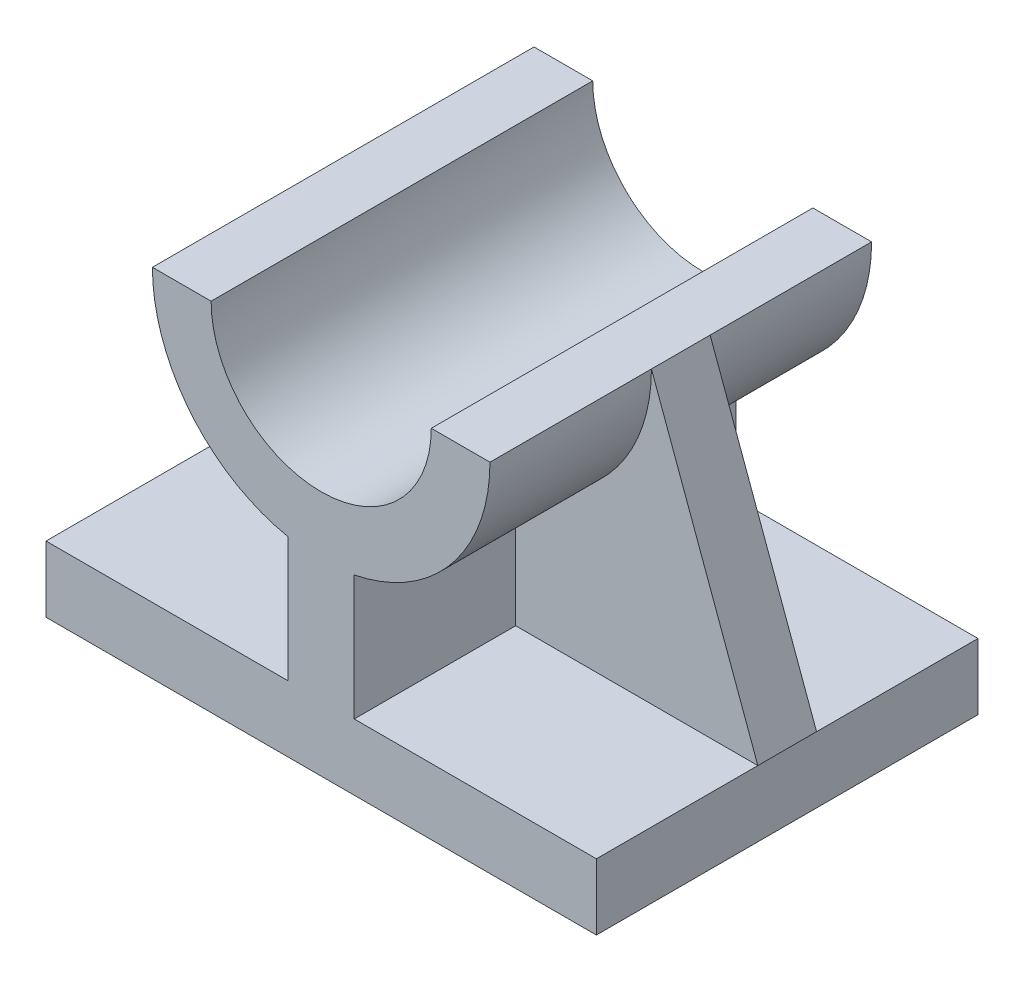
ISO-10303-21;
HEADER;
FILE_DESCRIPTION(('STEP AP214'),'2;1');
FILE_NAME('part.step','',(''),(''),'','','');
FILE_SCHEMA(('AUTOMOTIVE_DESIGN { 1 0 10303 214 1 1 1 1 }'));
ENDSEC;
DATA;
#1=APPLICATION_CONTEXT('core data for automotive mechanical design processes');
#2=APPLICATION_PROTOCOL_DEFINITION('international standard','automotive_design',2000,#1);
#3=PRODUCT_CONTEXT('',#1,'mechanical');
#4=PRODUCT('Part','Part','',(#3));
#5=PRODUCT_RELATED_PRODUCT_CATEGORY('part','',(#4));
#6=PRODUCT_DEFINITION_FORMATION('','',#4);
#7=PRODUCT_DEFINITION_CONTEXT('part definition',#1,'design');
#8=PRODUCT_DEFINITION('design','',#6,#7);
#9=PRODUCT_DEFINITION_SHAPE('','',#8);
#10=(LENGTH_UNIT() NAMED_UNIT(*) SI_UNIT(.MILLI.,.METRE.));
#11=(NAMED_UNIT(*) PLANE_ANGLE_UNIT() SI_UNIT($,.RADIAN.));
#12=(NAMED_UNIT(*) SI_UNIT($,.STERADIAN.) SOLID_ANGLE_UNIT());
#13=UNCERTAINTY_MEASURE_WITH_UNIT(LENGTH_MEASURE(1.E-05),#10,'distance_accuracy_value','');
#14=(GEOMETRIC_REPRESENTATION_CONTEXT(3) GLOBAL_UNCERTAINTY_ASSIGNED_CONTEXT((#13)) GLOBAL_UNIT_ASSIGNED_CONTEXT((#10,
#11,#12)) REPRESENTATION_CONTEXT('',''));
#15=CARTESIAN_POINT('',(0.,0.,0.));
#16=DIRECTION('',(0.,0.,1.));
#17=DIRECTION('',(1.,0.,0.));
#18=AXIS2_PLACEMENT_3D('',#15,#16,#17);
#19=CARTESIAN_POINT('',(0.,9.,0.));
#20=DIRECTION('',(0.,1.,0.));
#21=DIRECTION('',(0.,0.,1.));
#22=AXIS2_PLACEMENT_3D('',#19,#20,#21);
#23=PLANE('',#22);
#24=DIRECTION('',(0.,0.,1.));
#25=VECTOR('',#24,1.);
#26=CARTESIAN_POINT('',(4.5,9.,-26.));
#27=LINE('',#26,#25);
#28=CARTESIAN_POINT('',(4.5,9.,-26.));
#29=VERTEX_POINT('',#28);
#30=CARTESIAN_POINT('',(4.5,9.,-4.00000000000001));
#31=VERTEX_POINT('',#30);
#32=EDGE_CURVE('E159',#29,#31,#27,.T.);
#33=ORIENTED_EDGE('',*,*,#32,.T.);
#34=DIRECTION('',(1.,0.,0.));
#35=VECTOR('',#34,1.);
#36=CARTESIAN_POINT('',(4.5,9.,-4.));
#37=LINE('',#36,#35);
#38=CARTESIAN_POINT('',(37.5,9.,-4.00000000000001));
#39=VERTEX_POINT('',#38);
#40=EDGE_CURVE('E50',#31,#39,#37,.T.);
#41=ORIENTED_EDGE('',*,*,#40,.T.);
#42=DIRECTION('',(0.,0.,-1.));
#43=VECTOR('',#42,1.);
#44=CARTESIAN_POINT('',(37.5,9.,-26.));
#45=LINE('',#44,#43);
#46=CARTESIAN_POINT('',(37.5,9.,-26.));
#47=VERTEX_POINT('',#46);
#48=EDGE_CURVE('E245',#39,#47,#45,.T.);
#49=ORIENTED_EDGE('',*,*,#48,.T.);
#50=DIRECTION('',(-1.,0.,0.));
#51=VECTOR('',#50,1.);
#52=CARTESIAN_POINT('',(-37.5,9.,-26.));
#53=LINE('',#52,#51);
#54=EDGE_CURVE('E246',#47,#29,#53,.T.);
#55=ORIENTED_EDGE('',*,*,#54,.T.);
#56=EDGE_LOOP('',(#33,#41,#49,#55));
#57=FACE_BOUND('',#56,.T.);
#58=ADVANCED_FACE('F35',(#57),#23,.T.);
#59=CARTESIAN_POINT('',(0.,48.5554871372799,-26.));
#60=DIRECTION('',(0.,0.,1.));
#61=DIRECTION('',(1.,0.,0.));
#62=AXIS2_PLACEMENT_3D('',#59,#60,#61);
#63=CYLINDRICAL_SURFACE('',#62,23.);
#64=DIRECTION('',(0.,0.,1.));
#65=VECTOR('',#64,1.);
#66=CARTESIAN_POINT('',(23.,48.5554871372799,-26.));
#67=LINE('',#66,#65);
#68=CARTESIAN_POINT('',(23.,48.5554871372799,-26.));
#69=VERTEX_POINT('',#68);
#70=CARTESIAN_POINT('',(23.,48.5554871372799,-4.00000000000001));
#71=VERTEX_POINT('',#70);
#72=EDGE_CURVE('E229',#69,#71,#67,.T.);
#73=ORIENTED_EDGE('',*,*,#72,.T.);
#74=CARTESIAN_POINT('',(0.,48.5554871372799,-4.));
#75=DIRECTION('',(0.,0.,-1.));
#76=DIRECTION('',(1.,0.,0.));
#77=AXIS2_PLACEMENT_3D('',#74,#75,#76);
#78=CIRCLE('',#77,23.);
#79=CARTESIAN_POINT('',(4.5,26.,-4.00000000000001));
#80=VERTEX_POINT('',#79);
#81=EDGE_CURVE('E184',#71,#80,#78,.T.);
#82=ORIENTED_EDGE('',*,*,#81,.T.);
#83=DIRECTION('',(0.,0.,1.));
#84=VECTOR('',#83,1.);
#85=CARTESIAN_POINT('',(4.5,26.,-26.));
#86=LINE('',#85,#84);
#87=CARTESIAN_POINT('',(4.5,26.,-26.));
#88=VERTEX_POINT('',#87);
#89=EDGE_CURVE('E233',#88,#80,#86,.T.);
#90=ORIENTED_EDGE('',*,*,#89,.F.);
#91=CARTESIAN_POINT('',(0.,48.5554871372799,-26.));
#92=DIRECTION('',(0.,0.,1.));
#93=DIRECTION('',(1.,0.,0.));
#94=AXIS2_PLACEMENT_3D('',#91,#92,#93);
#95=CIRCLE('',#94,23.);
#96=EDGE_CURVE('E202',#88,#69,#95,.T.);
#97=ORIENTED_EDGE('',*,*,#96,.T.);
#98=EDGE_LOOP('',(#73,#82,#90,#97));
#99=FACE_BOUND('',#98,.T.);
#100=ADVANCED_FACE('F304',(#99),#63,.T.);
#101=CARTESIAN_POINT('',(4.5,0.,-26.));
#102=DIRECTION('',(1.,0.,0.));
#103=DIRECTION('',(0.,1.,0.));
#104=AXIS2_PLACEMENT_3D('',#101,#102,#103);
#105=PLANE('',#104);
#106=ORIENTED_EDGE('',*,*,#89,.T.);
#107=DIRECTION('',(0.,-1.,0.));
#108=VECTOR('',#107,1.);
#109=CARTESIAN_POINT('',(4.5,26.,-4.));
#110=LINE('',#109,#108);
#111=EDGE_CURVE('E178',#80,#31,#110,.T.);
#112=ORIENTED_EDGE('',*,*,#111,.T.);
#113=ORIENTED_EDGE('',*,*,#32,.F.);
#114=DIRECTION('',(0.,1.,0.));
#115=VECTOR('',#114,1.);
#116=CARTESIAN_POINT('',(4.5,0.,-26.));
#117=LINE('',#116,#115);
#118=EDGE_CURVE('E204',#29,#88,#117,.T.);
#119=ORIENTED_EDGE('',*,*,#118,.T.);
#120=EDGE_LOOP('',(#106,#112,#113,#119));
#121=FACE_BOUND('',#120,.T.);
#122=ADVANCED_FACE('F305',(#121),#105,.T.);
#123=DIRECTION('',(1.,0.,0.));
#124=VECTOR('',#123,1.);
#125=CARTESIAN_POINT('',(4.5,9.,4.));
#126=LINE('',#125,#124);
#127=CARTESIAN_POINT('',(4.5,9.,4.));
#128=VERTEX_POINT('',#127);
#129=CARTESIAN_POINT('',(37.5,9.,3.99999999999999));
#130=VERTEX_POINT('',#129);
#131=EDGE_CURVE('E163',#128,#130,#126,.T.);
#132=ORIENTED_EDGE('',*,*,#131,.F.);
#133=CARTESIAN_POINT('',(4.5,9.,26.));
#134=VERTEX_POINT('',#133);
#135=EDGE_CURVE('E149',#128,#134,#27,.T.);
#136=ORIENTED_EDGE('',*,*,#135,.T.);
#137=DIRECTION('',(1.,0.,0.));
#138=VECTOR('',#137,1.);
#139=CARTESIAN_POINT('',(-37.5,9.,26.));
#140=LINE('',#139,#138);
#141=CARTESIAN_POINT('',(37.5,9.,26.));
#142=VERTEX_POINT('',#141);
#143=EDGE_CURVE('E251',#134,#142,#140,.T.);
#144=ORIENTED_EDGE('',*,*,#143,.T.);
#145=EDGE_CURVE('E165',#142,#130,#45,.T.);
#146=ORIENTED_EDGE('',*,*,#145,.T.);
#147=EDGE_LOOP('',(#132,#136,#144,#146));
#148=FACE_BOUND('',#147,.T.);
#149=ADVANCED_FACE('F164',(#148),#23,.T.);
#150=CARTESIAN_POINT('',(37.5,9.,-26.));
#151=DIRECTION('',(-1.,0.,0.));
#152=DIRECTION('',(0.,0.,1.));
#153=AXIS2_PLACEMENT_3D('',#150,#151,#152);
#154=PLANE('',#153);
#155=DIRECTION('',(0.,0.,-1.));
#156=VECTOR('',#155,1.);
#157=CARTESIAN_POINT('',(37.5,0.,-26.));
#158=LINE('',#157,#156);
#159=CARTESIAN_POINT('',(37.5,0.,26.));
#160=VERTEX_POINT('',#159);
#161=CARTESIAN_POINT('',(37.5,0.,-26.));
#162=VERTEX_POINT('',#161);
#163=EDGE_CURVE('E228',#160,#162,#158,.T.);
#164=ORIENTED_EDGE('',*,*,#163,.T.);
#165=DIRECTION('',(0.,-1.,0.));
#166=VECTOR('',#165,1.);
#167=CARTESIAN_POINT('',(37.5,9.,-26.));
#168=LINE('',#167,#166);
#169=EDGE_CURVE('E11',#47,#162,#168,.T.);
#170=ORIENTED_EDGE('',*,*,#169,.F.);
#171=ORIENTED_EDGE('',*,*,#48,.F.);
#172=DIRECTION('',(0.,0.,1.));
#173=VECTOR('',#172,1.);
#174=CARTESIAN_POINT('',(37.5,9.,-4.));
#175=LINE('',#174,#173);
#176=EDGE_CURVE('E57',#39,#130,#175,.T.);
#177=ORIENTED_EDGE('',*,*,#176,.T.);
#178=ORIENTED_EDGE('',*,*,#145,.F.);
#179=DIRECTION('',(0.,-1.,0.));
#180=VECTOR('',#179,1.);
#181=CARTESIAN_POINT('',(37.5,9.,26.));
#182=LINE('',#181,#180);
#183=EDGE_CURVE('E255',#142,#160,#182,.T.);
#184=ORIENTED_EDGE('',*,*,#183,.T.);
#185=EDGE_LOOP('',(#164,#170,#171,#177,#178,#184));
#186=FACE_BOUND('',#185,.T.);
#187=ADVANCED_FACE('F37',(#186),#154,.F.);
#188=CARTESIAN_POINT('',(-37.5,9.,-26.));
#189=DIRECTION('',(0.,0.,1.));
#190=DIRECTION('',(1.,0.,0.));
#191=AXIS2_PLACEMENT_3D('',#188,#189,#190);
#192=PLANE('',#191);
#193=DIRECTION('',(-1.,0.,0.));
#194=VECTOR('',#193,1.);
#195=CARTESIAN_POINT('',(-37.5,0.,-26.));
#196=LINE('',#195,#194);
#197=CARTESIAN_POINT('',(-37.5,0.,-26.));
#198=VERTEX_POINT('',#197);
#199=EDGE_CURVE('E258',#162,#198,#196,.T.);
#200=ORIENTED_EDGE('',*,*,#199,.T.);
#201=DIRECTION('',(0.,-1.,0.));
#202=VECTOR('',#201,1.);
#203=CARTESIAN_POINT('',(-37.5,9.,-26.));
#204=LINE('',#203,#202);
#205=CARTESIAN_POINT('',(-37.5,9.,-26.));
#206=VERTEX_POINT('',#205);
#207=EDGE_CURVE('E43',#206,#198,#204,.T.);
#208=ORIENTED_EDGE('',*,*,#207,.F.);
#209=CARTESIAN_POINT('',(-4.5,9.,-26.));
#210=VERTEX_POINT('',#209);
#211=EDGE_CURVE('E244',#210,#206,#53,.T.);
#212=ORIENTED_EDGE('',*,*,#211,.F.);
#213=DIRECTION('',(0.,1.,0.));
#214=VECTOR('',#213,1.);
#215=CARTESIAN_POINT('',(-4.5,0.,-26.));
#216=LINE('',#215,#214);
#217=CARTESIAN_POINT('',(-4.5,26.,-26.));
#218=VERTEX_POINT('',#217);
#219=EDGE_CURVE('E201',#210,#218,#216,.T.);
#220=ORIENTED_EDGE('',*,*,#219,.T.);
#221=CARTESIAN_POINT('',(-23.,48.5554871372799,-26.));
#222=VERTEX_POINT('',#221);
#223=EDGE_CURVE('E198',#222,#218,#95,.T.);
#224=ORIENTED_EDGE('',*,*,#223,.F.);
#225=DIRECTION('',(-1.,0.,0.));
#226=VECTOR('',#225,1.);
#227=CARTESIAN_POINT('',(0.,48.5554871372799,-26.));
#228=LINE('',#227,#226);
#229=CARTESIAN_POINT('',(-15.,48.5554871372799,-26.));
#230=VERTEX_POINT('',#229);
#231=EDGE_CURVE('E194',#230,#222,#228,.T.);
#232=ORIENTED_EDGE('',*,*,#231,.F.);
#233=CARTESIAN_POINT('',(0.,48.5554871372799,-26.));
#234=DIRECTION('',(0.,0.,1.));
#235=DIRECTION('',(1.,0.,0.));
#236=AXIS2_PLACEMENT_3D('',#233,#234,#235);
#237=CIRCLE('',#236,15.);
#238=CARTESIAN_POINT('',(15.,48.5554871372799,-26.));
#239=VERTEX_POINT('',#238);
#240=EDGE_CURVE('E191',#230,#239,#237,.T.);
#241=ORIENTED_EDGE('',*,*,#240,.T.);
#242=DIRECTION('',(1.,0.,0.));
#243=VECTOR('',#242,1.);
#244=CARTESIAN_POINT('',(0.,48.5554871372799,-26.));
#245=LINE('',#244,#243);
#246=EDGE_CURVE('E207',#239,#69,#245,.T.);
#247=ORIENTED_EDGE('',*,*,#246,.T.);
#248=ORIENTED_EDGE('',*,*,#96,.F.);
#249=ORIENTED_EDGE('',*,*,#118,.F.);
#250=ORIENTED_EDGE('',*,*,#54,.F.);
#251=ORIENTED_EDGE('',*,*,#169,.T.);
#252=EDGE_LOOP('',(#200,#208,#212,#220,#224,#232,#241,#247,#248,#249,#250,#251));
#253=FACE_BOUND('',#252,.T.);
#254=ADVANCED_FACE('F287',(#253),#192,.F.);
#255=CARTESIAN_POINT('',(-37.5,9.,-26.));
#256=DIRECTION('',(1.,0.,0.));
#257=DIRECTION('',(0.,0.,-1.));
#258=AXIS2_PLACEMENT_3D('',#255,#256,#257);
#259=PLANE('',#258);
#260=DIRECTION('',(0.,0.,1.));
#261=VECTOR('',#260,1.);
#262=CARTESIAN_POINT('',(-37.5,0.,-26.));
#263=LINE('',#262,#261);
#264=CARTESIAN_POINT('',(-37.5,0.,26.));
#265=VERTEX_POINT('',#264);
#266=EDGE_CURVE('E260',#198,#265,#263,.T.);
#267=ORIENTED_EDGE('',*,*,#266,.T.);
#268=DIRECTION('',(0.,-1.,0.));
#269=VECTOR('',#268,1.);
#270=CARTESIAN_POINT('',(-37.5,9.,26.));
#271=LINE('',#270,#269);
#272=CARTESIAN_POINT('',(-37.5,9.,26.));
#273=VERTEX_POINT('',#272);
#274=EDGE_CURVE('E266',#273,#265,#271,.T.);
#275=ORIENTED_EDGE('',*,*,#274,.F.);
#276=DIRECTION('',(0.,0.,1.));
#277=VECTOR('',#276,1.);
#278=CARTESIAN_POINT('',(-37.5,9.,-26.));
#279=LINE('',#278,#277);
#280=EDGE_CURVE('E249',#206,#273,#279,.T.);
#281=ORIENTED_EDGE('',*,*,#280,.F.);
#282=ORIENTED_EDGE('',*,*,#207,.T.);
#283=EDGE_LOOP('',(#267,#275,#281,#282));
#284=FACE_BOUND('',#283,.T.);
#285=ADVANCED_FACE('F273',(#284),#259,.F.);
#286=CARTESIAN_POINT('',(-37.5,9.,26.));
#287=DIRECTION('',(0.,0.,-1.));
#288=DIRECTION('',(-1.,0.,0.));
#289=AXIS2_PLACEMENT_3D('',#286,#287,#288);
#290=PLANE('',#289);
#291=DIRECTION('',(1.,0.,0.));
#292=VECTOR('',#291,1.);
#293=CARTESIAN_POINT('',(-37.5,0.,26.));
#294=LINE('',#293,#292);
#295=EDGE_CURVE('E262',#265,#160,#294,.T.);
#296=ORIENTED_EDGE('',*,*,#295,.T.);
#297=ORIENTED_EDGE('',*,*,#183,.F.);
#298=ORIENTED_EDGE('',*,*,#143,.F.);
#299=DIRECTION('',(0.,1.,0.));
#300=VECTOR('',#299,1.);
#301=CARTESIAN_POINT('',(4.5,0.,26.));
#302=LINE('',#301,#300);
#303=CARTESIAN_POINT('',(4.5,26.,26.));
#304=VERTEX_POINT('',#303);
#305=EDGE_CURVE('E156',#134,#304,#302,.T.);
#306=ORIENTED_EDGE('',*,*,#305,.T.);
#307=CARTESIAN_POINT('',(0.,48.5554871372799,26.));
#308=DIRECTION('',(0.,0.,1.));
#309=DIRECTION('',(1.,0.,0.));
#310=AXIS2_PLACEMENT_3D('',#307,#308,#309);
#311=CIRCLE('',#310,23.);
#312=CARTESIAN_POINT('',(23.,48.5554871372799,26.));
#313=VERTEX_POINT('',#312);
#314=EDGE_CURVE('E219',#304,#313,#311,.T.);
#315=ORIENTED_EDGE('',*,*,#314,.T.);
#316=DIRECTION('',(1.,0.,0.));
#317=VECTOR('',#316,1.);
#318=CARTESIAN_POINT('',(0.,48.5554871372799,26.));
#319=LINE('',#318,#317);
#320=CARTESIAN_POINT('',(15.,48.5554871372799,26.));
#321=VERTEX_POINT('',#320);
#322=EDGE_CURVE('E195',#321,#313,#319,.T.);
#323=ORIENTED_EDGE('',*,*,#322,.F.);
#324=CARTESIAN_POINT('',(0.,48.5554871372799,26.));
#325=DIRECTION('',(0.,0.,1.));
#326=DIRECTION('',(1.,0.,0.));
#327=AXIS2_PLACEMENT_3D('',#324,#325,#326);
#328=CIRCLE('',#327,15.);
#329=CARTESIAN_POINT('',(-15.,48.5554871372799,26.));
#330=VERTEX_POINT('',#329);
#331=EDGE_CURVE('E189',#330,#321,#328,.T.);
#332=ORIENTED_EDGE('',*,*,#331,.F.);
#333=DIRECTION('',(-1.,0.,0.));
#334=VECTOR('',#333,1.);
#335=CARTESIAN_POINT('',(0.,48.5554871372799,26.));
#336=LINE('',#335,#334);
#337=CARTESIAN_POINT('',(-23.,48.5554871372799,26.));
#338=VERTEX_POINT('',#337);
#339=EDGE_CURVE('E212',#330,#338,#336,.T.);
#340=ORIENTED_EDGE('',*,*,#339,.T.);
#341=CARTESIAN_POINT('',(-4.5,26.,26.));
#342=VERTEX_POINT('',#341);
#343=EDGE_CURVE('E215',#338,#342,#311,.T.);
#344=ORIENTED_EDGE('',*,*,#343,.T.);
#345=DIRECTION('',(0.,1.,0.));
#346=VECTOR('',#345,1.);
#347=CARTESIAN_POINT('',(-4.5,0.,26.));
#348=LINE('',#347,#346);
#349=CARTESIAN_POINT('',(-4.5,9.,26.));
#350=VERTEX_POINT('',#349);
#351=EDGE_CURVE('E218',#350,#342,#348,.T.);
#352=ORIENTED_EDGE('',*,*,#351,.F.);
#353=EDGE_CURVE('E252',#273,#350,#140,.T.);
#354=ORIENTED_EDGE('',*,*,#353,.F.);
#355=ORIENTED_EDGE('',*,*,#274,.T.);
#356=EDGE_LOOP('',(#296,#297,#298,#306,#315,#323,#332,#340,#344,#352,#354,#355));
#357=FACE_BOUND('',#356,.T.);
#358=ADVANCED_FACE('F283',(#357),#290,.F.);
#359=DIRECTION('',(0.,0.,1.));
#360=VECTOR('',#359,1.);
#361=CARTESIAN_POINT('',(-4.5,9.,-26.));
#362=LINE('',#361,#360);
#363=EDGE_CURVE('E160',#210,#350,#362,.T.);
#364=ORIENTED_EDGE('',*,*,#363,.F.);
#365=ORIENTED_EDGE('',*,*,#211,.T.);
#366=ORIENTED_EDGE('',*,*,#280,.T.);
#367=ORIENTED_EDGE('',*,*,#353,.T.);
#368=EDGE_LOOP('',(#364,#365,#366,#367));
#369=FACE_BOUND('',#368,.T.);
#370=ADVANCED_FACE('F313',(#369),#23,.T.);
#371=CARTESIAN_POINT('',(0.,0.,0.));
#372=DIRECTION('',(0.,1.,0.));
#373=DIRECTION('',(0.,0.,1.));
#374=AXIS2_PLACEMENT_3D('',#371,#372,#373);
#375=PLANE('',#374);
#376=ORIENTED_EDGE('',*,*,#163,.F.);
#377=ORIENTED_EDGE('',*,*,#295,.F.);
#378=ORIENTED_EDGE('',*,*,#266,.F.);
#379=ORIENTED_EDGE('',*,*,#199,.F.);
#380=EDGE_LOOP('',(#376,#377,#378,#379));
#381=FACE_BOUND('',#380,.T.);
#382=ADVANCED_FACE('F280',(#381),#375,.F.);
#383=CARTESIAN_POINT('',(0.,48.5554871372799,-26.));
#384=DIRECTION('',(0.,0.,1.));
#385=DIRECTION('',(1.,0.,0.));
#386=AXIS2_PLACEMENT_3D('',#383,#384,#385);
#387=CYLINDRICAL_SURFACE('',#386,15.);
#388=ORIENTED_EDGE('',*,*,#331,.T.);
#389=DIRECTION('',(0.,0.,1.));
#390=VECTOR('',#389,1.);
#391=CARTESIAN_POINT('',(15.,48.5554871372799,-26.));
#392=LINE('',#391,#390);
#393=EDGE_CURVE('E225',#239,#321,#392,.T.);
#394=ORIENTED_EDGE('',*,*,#393,.F.);
#395=ORIENTED_EDGE('',*,*,#240,.F.);
#396=DIRECTION('',(0.,0.,1.));
#397=VECTOR('',#396,1.);
#398=CARTESIAN_POINT('',(-15.,48.5554871372799,-26.));
#399=LINE('',#398,#397);
#400=EDGE_CURVE('E209',#230,#330,#399,.T.);
#401=ORIENTED_EDGE('',*,*,#400,.T.);
#402=EDGE_LOOP('',(#388,#394,#395,#401));
#403=FACE_BOUND('',#402,.T.);
#404=ADVANCED_FACE('F331',(#403),#387,.F.);
#405=CARTESIAN_POINT('',(0.,48.5554871372799,-26.));
#406=DIRECTION('',(0.,-1.,0.));
#407=DIRECTION('',(0.,0.,-1.));
#408=AXIS2_PLACEMENT_3D('',#405,#406,#407);
#409=PLANE('',#408);
#410=ORIENTED_EDGE('',*,*,#322,.T.);
#411=CARTESIAN_POINT('',(23.,48.5554871372799,3.99999999999999));
#412=VERTEX_POINT('',#411);
#413=EDGE_CURVE('E232',#412,#313,#67,.T.);
#414=ORIENTED_EDGE('',*,*,#413,.F.);
#415=DIRECTION('',(0.,0.,1.));
#416=VECTOR('',#415,1.);
#417=CARTESIAN_POINT('',(23.,48.5554871372799,-4.));
#418=LINE('',#417,#416);
#419=EDGE_CURVE('E186',#71,#412,#418,.T.);
#420=ORIENTED_EDGE('',*,*,#419,.F.);
#421=ORIENTED_EDGE('',*,*,#72,.F.);
#422=ORIENTED_EDGE('',*,*,#246,.F.);
#423=ORIENTED_EDGE('',*,*,#393,.T.);
#424=EDGE_LOOP('',(#410,#414,#420,#421,#422,#423));
#425=FACE_BOUND('',#424,.T.);
#426=ADVANCED_FACE('F301',(#425),#409,.F.);
#427=CARTESIAN_POINT('',(0.,48.5554871372799,4.));
#428=DIRECTION('',(0.,0.,-1.));
#429=DIRECTION('',(1.,0.,0.));
#430=AXIS2_PLACEMENT_3D('',#427,#428,#429);
#431=CIRCLE('',#430,23.);
#432=CARTESIAN_POINT('',(4.5,26.,3.99999999999999));
#433=VERTEX_POINT('',#432);
#434=EDGE_CURVE('E173',#412,#433,#431,.T.);
#435=ORIENTED_EDGE('',*,*,#434,.F.);
#436=ORIENTED_EDGE('',*,*,#413,.T.);
#437=ORIENTED_EDGE('',*,*,#314,.F.);
#438=EDGE_CURVE('E235',#433,#304,#86,.T.);
#439=ORIENTED_EDGE('',*,*,#438,.F.);
#440=EDGE_LOOP('',(#435,#436,#437,#439));
#441=FACE_BOUND('',#440,.T.);
#442=ADVANCED_FACE('F316',(#441),#63,.T.);
#443=DIRECTION('',(0.,-1.,0.));
#444=VECTOR('',#443,1.);
#445=CARTESIAN_POINT('',(4.5,26.,4.));
#446=LINE('',#445,#444);
#447=EDGE_CURVE('E153',#433,#128,#446,.T.);
#448=ORIENTED_EDGE('',*,*,#447,.F.);
#449=ORIENTED_EDGE('',*,*,#438,.T.);
#450=ORIENTED_EDGE('',*,*,#305,.F.);
#451=ORIENTED_EDGE('',*,*,#135,.F.);
#452=EDGE_LOOP('',(#448,#449,#450,#451));
#453=FACE_BOUND('',#452,.T.);
#454=ADVANCED_FACE('F151',(#453),#105,.T.);
#455=CARTESIAN_POINT('',(-4.5,0.,-26.));
#456=DIRECTION('',(1.,0.,0.));
#457=DIRECTION('',(0.,0.,-1.));
#458=AXIS2_PLACEMENT_3D('',#455,#456,#457);
#459=PLANE('',#458);
#460=ORIENTED_EDGE('',*,*,#351,.T.);
#461=DIRECTION('',(0.,0.,1.));
#462=VECTOR('',#461,1.);
#463=CARTESIAN_POINT('',(-4.5,26.,-26.));
#464=LINE('',#463,#462);
#465=EDGE_CURVE('E238',#218,#342,#464,.T.);
#466=ORIENTED_EDGE('',*,*,#465,.F.);
#467=ORIENTED_EDGE('',*,*,#219,.F.);
#468=ORIENTED_EDGE('',*,*,#363,.T.);
#469=EDGE_LOOP('',(#460,#466,#467,#468));
#470=FACE_BOUND('',#469,.T.);
#471=ADVANCED_FACE('F319',(#470),#459,.F.);
#472=ORIENTED_EDGE('',*,*,#343,.F.);
#473=DIRECTION('',(0.,0.,1.));
#474=VECTOR('',#473,1.);
#475=CARTESIAN_POINT('',(-23.,48.5554871372799,-26.));
#476=LINE('',#475,#474);
#477=EDGE_CURVE('E240',#222,#338,#476,.T.);
#478=ORIENTED_EDGE('',*,*,#477,.F.);
#479=ORIENTED_EDGE('',*,*,#223,.T.);
#480=ORIENTED_EDGE('',*,*,#465,.T.);
#481=EDGE_LOOP('',(#472,#478,#479,#480));
#482=FACE_BOUND('',#481,.T.);
#483=ADVANCED_FACE('F315',(#482),#63,.T.);
#484=CARTESIAN_POINT('',(0.,48.5554871372799,-26.));
#485=DIRECTION('',(0.,1.,0.));
#486=DIRECTION('',(0.,0.,1.));
#487=AXIS2_PLACEMENT_3D('',#484,#485,#486);
#488=PLANE('',#487);
#489=ORIENTED_EDGE('',*,*,#339,.F.);
#490=ORIENTED_EDGE('',*,*,#400,.F.);
#491=ORIENTED_EDGE('',*,*,#231,.T.);
#492=ORIENTED_EDGE('',*,*,#477,.T.);
#493=EDGE_LOOP('',(#489,#490,#491,#492));
#494=FACE_BOUND('',#493,.T.);
#495=ADVANCED_FACE('F343',(#494),#488,.T.);
#496=CARTESIAN_POINT('',(37.5,9.,-4.));
#497=DIRECTION('',(0.938904534711074,0.344177678966812,0.));
#498=DIRECTION('',(-0.344177678966812,0.938904534711074,0.));
#499=AXIS2_PLACEMENT_3D('',#496,#497,#498);
#500=PLANE('',#499);
#501=ORIENTED_EDGE('',*,*,#419,.T.);
#502=DIRECTION('',(-0.344177678966812,0.938904534711074,0.));
#503=VECTOR('',#502,1.);
#504=CARTESIAN_POINT('',(37.5,9.,4.));
#505=LINE('',#504,#503);
#506=EDGE_CURVE('E169',#130,#412,#505,.T.);
#507=ORIENTED_EDGE('',*,*,#506,.F.);
#508=ORIENTED_EDGE('',*,*,#176,.F.);
#509=DIRECTION('',(-0.344177678966812,0.938904534711074,0.));
#510=VECTOR('',#509,1.);
#511=CARTESIAN_POINT('',(37.5,9.,-4.));
#512=LINE('',#511,#510);
#513=EDGE_CURVE('E181',#39,#71,#512,.T.);
#514=ORIENTED_EDGE('',*,*,#513,.T.);
#515=EDGE_LOOP('',(#501,#507,#508,#514));
#516=FACE_BOUND('',#515,.T.);
#517=ADVANCED_FACE('F297',(#516),#500,.T.);
#518=CARTESIAN_POINT('',(0.,48.5554871372799,-4.));
#519=DIRECTION('',(0.,0.,1.));
#520=DIRECTION('',(1.,0.,0.));
#521=AXIS2_PLACEMENT_3D('',#518,#519,#520);
#522=PLANE('',#521);
#523=ORIENTED_EDGE('',*,*,#111,.F.);
#524=ORIENTED_EDGE('',*,*,#81,.F.);
#525=ORIENTED_EDGE('',*,*,#513,.F.);
#526=ORIENTED_EDGE('',*,*,#40,.F.);
#527=EDGE_LOOP('',(#523,#524,#525,#526));
#528=FACE_BOUND('',#527,.T.);
#529=ADVANCED_FACE('F294',(#528),#522,.F.);
#530=CARTESIAN_POINT('',(0.,48.5554871372799,4.));
#531=DIRECTION('',(0.,0.,1.));
#532=DIRECTION('',(1.,0.,0.));
#533=AXIS2_PLACEMENT_3D('',#530,#531,#532);
#534=PLANE('',#533);
#535=ORIENTED_EDGE('',*,*,#447,.T.);
#536=ORIENTED_EDGE('',*,*,#131,.T.);
#537=ORIENTED_EDGE('',*,*,#506,.T.);
#538=ORIENTED_EDGE('',*,*,#434,.T.);
#539=EDGE_LOOP('',(#535,#536,#537,#538));
#540=FACE_BOUND('',#539,.T.);
#541=ADVANCED_FACE('F172',(#540),#534,.T.);
#542=CLOSED_SHELL('',(#58,#100,#122,#149,#187,#254,#285,#358,#370,#382,#404,#426,#442,#454,#471,
#483,#495,#517,#529,#541));
#543=MANIFOLD_SOLID_BREP('B2',#542);
#544=ADVANCED_BREP_SHAPE_REPRESENTATION('',(#18,#543),#14);
#545=SHAPE_DEFINITION_REPRESENTATION(#9,#544);
ENDSEC;
END-ISO-10303-21;
